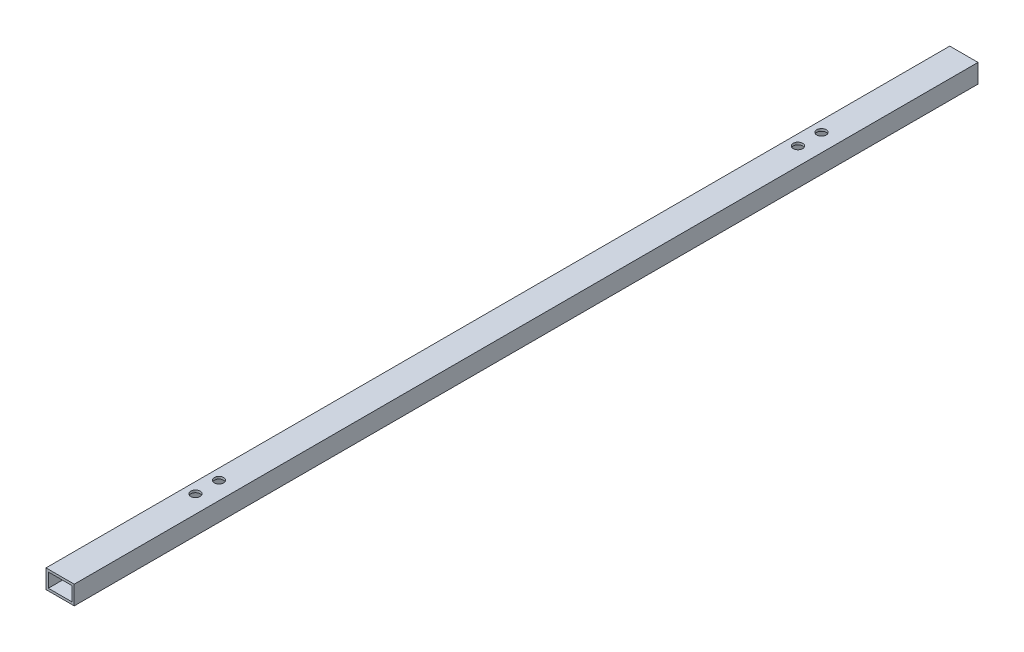
ISO-10303-21;
HEADER;
FILE_DESCRIPTION(('STEP AP214'),'2;1');
FILE_NAME('part.step','',(''),(''),'','','');
FILE_SCHEMA(('AUTOMOTIVE_DESIGN { 1 0 10303 214 1 1 1 1 }'));
ENDSEC;
DATA;
#1=APPLICATION_CONTEXT('core data for automotive mechanical design processes');
#2=APPLICATION_PROTOCOL_DEFINITION('international standard','automotive_design',2000,#1);
#3=PRODUCT_CONTEXT('',#1,'mechanical');
#4=PRODUCT('Part','Part','',(#3));
#5=PRODUCT_RELATED_PRODUCT_CATEGORY('part','',(#4));
#6=PRODUCT_DEFINITION_FORMATION('','',#4);
#7=PRODUCT_DEFINITION_CONTEXT('part definition',#1,'design');
#8=PRODUCT_DEFINITION('design','',#6,#7);
#9=PRODUCT_DEFINITION_SHAPE('','',#8);
#10=(LENGTH_UNIT() NAMED_UNIT(*) SI_UNIT(.MILLI.,.METRE.));
#11=(NAMED_UNIT(*) PLANE_ANGLE_UNIT() SI_UNIT($,.RADIAN.));
#12=(NAMED_UNIT(*) SI_UNIT($,.STERADIAN.) SOLID_ANGLE_UNIT());
#13=UNCERTAINTY_MEASURE_WITH_UNIT(LENGTH_MEASURE(1.E-05),#10,'distance_accuracy_value','');
#14=(GEOMETRIC_REPRESENTATION_CONTEXT(3) GLOBAL_UNCERTAINTY_ASSIGNED_CONTEXT((#13)) GLOBAL_UNIT_ASSIGNED_CONTEXT((#10,
#11,#12)) REPRESENTATION_CONTEXT('',''));
#15=CARTESIAN_POINT('',(0.,0.,0.));
#16=DIRECTION('',(0.,0.,1.));
#17=DIRECTION('',(1.,0.,0.));
#18=AXIS2_PLACEMENT_3D('',#15,#16,#17);
#19=CARTESIAN_POINT('',(19.05,-12.7,609.6));
#20=DIRECTION('',(0.,1.,0.));
#21=DIRECTION('',(0.,0.,1.));
#22=AXIS2_PLACEMENT_3D('',#19,#20,#21);
#23=PLANE('',#22);
#24=CARTESIAN_POINT('',(-4.7625,-12.7,-422.275));
#25=DIRECTION('',(0.,1.,0.));
#26=DIRECTION('',(0.,0.,1.));
#27=AXIS2_PLACEMENT_3D('',#24,#25,#26);
#28=CIRCLE('',#27,6.35);
#29=CARTESIAN_POINT('',(-4.7625,-12.7,-415.925));
#30=VERTEX_POINT('',#29);
#31=EDGE_CURVE('E239',#30,#30,#28,.T.);
#32=ORIENTED_EDGE('',*,*,#31,.T.);
#33=EDGE_LOOP('',(#32));
#34=FACE_BOUND('',#33,.T.);
#35=CARTESIAN_POINT('',(-4.7625,-12.7,390.525));
#36=DIRECTION('',(0.,1.,0.));
#37=DIRECTION('',(0.,0.,1.));
#38=AXIS2_PLACEMENT_3D('',#35,#36,#37);
#39=CIRCLE('',#38,6.34999999999999);
#40=CARTESIAN_POINT('',(-4.7625,-12.7,396.875));
#41=VERTEX_POINT('',#40);
#42=EDGE_CURVE('E205',#41,#41,#39,.T.);
#43=ORIENTED_EDGE('',*,*,#42,.T.);
#44=EDGE_LOOP('',(#43));
#45=FACE_BOUND('',#44,.T.);
#46=DIRECTION('',(0.,0.,-1.));
#47=VECTOR('',#46,1.);
#48=CARTESIAN_POINT('',(-19.05,-12.7,609.6));
#49=LINE('',#48,#47);
#50=CARTESIAN_POINT('',(-19.05,-12.7,609.6));
#51=VERTEX_POINT('',#50);
#52=CARTESIAN_POINT('',(-19.05,-12.7,-609.6));
#53=VERTEX_POINT('',#52);
#54=EDGE_CURVE('E11',#51,#53,#49,.T.);
#55=ORIENTED_EDGE('',*,*,#54,.T.);
#56=DIRECTION('',(1.,0.,0.));
#57=VECTOR('',#56,1.);
#58=CARTESIAN_POINT('',(19.05,-12.7,-609.6));
#59=LINE('',#58,#57);
#60=CARTESIAN_POINT('',(19.05,-12.7,-609.6));
#61=VERTEX_POINT('',#60);
#62=EDGE_CURVE('E152',#53,#61,#59,.T.);
#63=ORIENTED_EDGE('',*,*,#62,.T.);
#64=DIRECTION('',(0.,0.,-1.));
#65=VECTOR('',#64,1.);
#66=CARTESIAN_POINT('',(19.05,-12.7,609.6));
#67=LINE('',#66,#65);
#68=CARTESIAN_POINT('',(19.05,-12.7,609.6));
#69=VERTEX_POINT('',#68);
#70=EDGE_CURVE('E49',#69,#61,#67,.T.);
#71=ORIENTED_EDGE('',*,*,#70,.F.);
#72=DIRECTION('',(1.,0.,0.));
#73=VECTOR('',#72,1.);
#74=CARTESIAN_POINT('',(19.05,-12.7,609.6));
#75=LINE('',#74,#73);
#76=EDGE_CURVE('E184',#51,#69,#75,.T.);
#77=ORIENTED_EDGE('',*,*,#76,.F.);
#78=EDGE_LOOP('',(#55,#63,#71,#77));
#79=FACE_BOUND('',#78,.T.);
#80=CARTESIAN_POINT('',(-4.7625,-12.7,-390.525));
#81=DIRECTION('',(0.,1.,0.));
#82=DIRECTION('',(0.,0.,1.));
#83=AXIS2_PLACEMENT_3D('',#80,#81,#82);
#84=CIRCLE('',#83,6.35);
#85=CARTESIAN_POINT('',(-4.7625,-12.7,-384.175));
#86=VERTEX_POINT('',#85);
#87=EDGE_CURVE('E240',#86,#86,#84,.F.);
#88=ORIENTED_EDGE('',*,*,#87,.F.);
#89=EDGE_LOOP('',(#88));
#90=FACE_BOUND('',#89,.T.);
#91=CARTESIAN_POINT('',(-4.7625,-12.7,422.275));
#92=DIRECTION('',(0.,1.,0.));
#93=DIRECTION('',(0.,0.,1.));
#94=AXIS2_PLACEMENT_3D('',#91,#92,#93);
#95=CIRCLE('',#94,6.34999999999999);
#96=CARTESIAN_POINT('',(-4.7625,-12.7,428.625));
#97=VERTEX_POINT('',#96);
#98=EDGE_CURVE('E231',#97,#97,#95,.F.);
#99=ORIENTED_EDGE('',*,*,#98,.F.);
#100=EDGE_LOOP('',(#99));
#101=FACE_BOUND('',#100,.T.);
#102=ADVANCED_FACE('F39',(#34,#45,#79,#90,#101),#23,.F.);
#103=CARTESIAN_POINT('',(19.05,12.7,609.6));
#104=DIRECTION('',(0.,-1.,0.));
#105=DIRECTION('',(0.,0.,-1.));
#106=AXIS2_PLACEMENT_3D('',#103,#104,#105);
#107=PLANE('',#106);
#108=CARTESIAN_POINT('',(-4.7625,12.7,-422.275));
#109=DIRECTION('',(0.,1.,0.));
#110=DIRECTION('',(0.,0.,1.));
#111=AXIS2_PLACEMENT_3D('',#108,#109,#110);
#112=CIRCLE('',#111,6.35);
#113=CARTESIAN_POINT('',(-4.7625,12.7,-415.925));
#114=VERTEX_POINT('',#113);
#115=EDGE_CURVE('E235',#114,#114,#112,.T.);
#116=ORIENTED_EDGE('',*,*,#115,.F.);
#117=EDGE_LOOP('',(#116));
#118=FACE_BOUND('',#117,.T.);
#119=CARTESIAN_POINT('',(-4.7625,12.7,390.525));
#120=DIRECTION('',(0.,1.,0.));
#121=DIRECTION('',(0.,0.,1.));
#122=AXIS2_PLACEMENT_3D('',#119,#120,#121);
#123=CIRCLE('',#122,6.34999999999999);
#124=CARTESIAN_POINT('',(-4.7625,12.7,396.875));
#125=VERTEX_POINT('',#124);
#126=EDGE_CURVE('E227',#125,#125,#123,.T.);
#127=ORIENTED_EDGE('',*,*,#126,.F.);
#128=EDGE_LOOP('',(#127));
#129=FACE_BOUND('',#128,.T.);
#130=DIRECTION('',(0.,0.,-1.));
#131=VECTOR('',#130,1.);
#132=CARTESIAN_POINT('',(19.05,12.7,609.6));
#133=LINE('',#132,#131);
#134=CARTESIAN_POINT('',(19.05,12.7,609.6));
#135=VERTEX_POINT('',#134);
#136=CARTESIAN_POINT('',(19.05,12.7,-609.6));
#137=VERTEX_POINT('',#136);
#138=EDGE_CURVE('E195',#135,#137,#133,.T.);
#139=ORIENTED_EDGE('',*,*,#138,.T.);
#140=DIRECTION('',(-1.,0.,0.));
#141=VECTOR('',#140,1.);
#142=CARTESIAN_POINT('',(19.05,12.7,-609.6));
#143=LINE('',#142,#141);
#144=CARTESIAN_POINT('',(-19.05,12.7,-609.6));
#145=VERTEX_POINT('',#144);
#146=EDGE_CURVE('E160',#137,#145,#143,.T.);
#147=ORIENTED_EDGE('',*,*,#146,.T.);
#148=DIRECTION('',(0.,0.,-1.));
#149=VECTOR('',#148,1.);
#150=CARTESIAN_POINT('',(-19.05,12.7,609.6));
#151=LINE('',#150,#149);
#152=CARTESIAN_POINT('',(-19.05,12.7,609.6));
#153=VERTEX_POINT('',#152);
#154=EDGE_CURVE('E192',#153,#145,#151,.T.);
#155=ORIENTED_EDGE('',*,*,#154,.F.);
#156=DIRECTION('',(-1.,0.,0.));
#157=VECTOR('',#156,1.);
#158=CARTESIAN_POINT('',(19.05,12.7,609.6));
#159=LINE('',#158,#157);
#160=EDGE_CURVE('E65',#135,#153,#159,.T.);
#161=ORIENTED_EDGE('',*,*,#160,.F.);
#162=EDGE_LOOP('',(#139,#147,#155,#161));
#163=FACE_BOUND('',#162,.T.);
#164=CARTESIAN_POINT('',(-4.7625,12.7,-390.525));
#165=DIRECTION('',(0.,1.,0.));
#166=DIRECTION('',(0.,0.,1.));
#167=AXIS2_PLACEMENT_3D('',#164,#165,#166);
#168=CIRCLE('',#167,6.35);
#169=CARTESIAN_POINT('',(-4.7625,12.7,-384.175));
#170=VERTEX_POINT('',#169);
#171=EDGE_CURVE('E251',#170,#170,#168,.F.);
#172=ORIENTED_EDGE('',*,*,#171,.T.);
#173=EDGE_LOOP('',(#172));
#174=FACE_BOUND('',#173,.T.);
#175=CARTESIAN_POINT('',(-4.7625,12.7,422.275));
#176=DIRECTION('',(0.,1.,0.));
#177=DIRECTION('',(0.,0.,1.));
#178=AXIS2_PLACEMENT_3D('',#175,#176,#177);
#179=CIRCLE('',#178,6.34999999999999);
#180=CARTESIAN_POINT('',(-4.7625,12.7,428.625));
#181=VERTEX_POINT('',#180);
#182=EDGE_CURVE('E244',#181,#181,#179,.F.);
#183=ORIENTED_EDGE('',*,*,#182,.T.);
#184=EDGE_LOOP('',(#183));
#185=FACE_BOUND('',#184,.T.);
#186=ADVANCED_FACE('F263',(#118,#129,#163,#174,#185),#107,.F.);
#187=CARTESIAN_POINT('',(15.875,-9.525,609.6));
#188=DIRECTION('',(0.,1.,0.));
#189=DIRECTION('',(0.,0.,1.));
#190=AXIS2_PLACEMENT_3D('',#187,#188,#189);
#191=PLANE('',#190);
#192=CARTESIAN_POINT('',(-4.7625,-9.525,-390.525));
#193=DIRECTION('',(0.,1.,0.));
#194=DIRECTION('',(0.,0.,1.));
#195=AXIS2_PLACEMENT_3D('',#192,#193,#194);
#196=CIRCLE('',#195,6.35);
#197=CARTESIAN_POINT('',(-4.7625,-9.525,-384.175));
#198=VERTEX_POINT('',#197);
#199=EDGE_CURVE('E209',#198,#198,#196,.F.);
#200=ORIENTED_EDGE('',*,*,#199,.T.);
#201=EDGE_LOOP('',(#200));
#202=FACE_BOUND('',#201,.T.);
#203=CARTESIAN_POINT('',(-4.7625,-9.525,390.525));
#204=DIRECTION('',(0.,1.,0.));
#205=DIRECTION('',(0.,0.,1.));
#206=AXIS2_PLACEMENT_3D('',#203,#204,#205);
#207=CIRCLE('',#206,6.34999999999999);
#208=CARTESIAN_POINT('',(-4.7625,-9.525,396.875));
#209=VERTEX_POINT('',#208);
#210=EDGE_CURVE('E204',#209,#209,#207,.T.);
#211=ORIENTED_EDGE('',*,*,#210,.F.);
#212=EDGE_LOOP('',(#211));
#213=FACE_BOUND('',#212,.T.);
#214=DIRECTION('',(0.,0.,-1.));
#215=VECTOR('',#214,1.);
#216=CARTESIAN_POINT('',(15.875,-9.525,609.6));
#217=LINE('',#216,#215);
#218=CARTESIAN_POINT('',(15.875,-9.525,609.6));
#219=VERTEX_POINT('',#218);
#220=CARTESIAN_POINT('',(15.875,-9.525,-609.6));
#221=VERTEX_POINT('',#220);
#222=EDGE_CURVE('E120',#219,#221,#217,.T.);
#223=ORIENTED_EDGE('',*,*,#222,.T.);
#224=DIRECTION('',(1.,0.,0.));
#225=VECTOR('',#224,1.);
#226=CARTESIAN_POINT('',(15.875,-9.525,-609.6));
#227=LINE('',#226,#225);
#228=CARTESIAN_POINT('',(-15.875,-9.525,-609.6));
#229=VERTEX_POINT('',#228);
#230=EDGE_CURVE('E123',#229,#221,#227,.T.);
#231=ORIENTED_EDGE('',*,*,#230,.F.);
#232=DIRECTION('',(0.,0.,-1.));
#233=VECTOR('',#232,1.);
#234=CARTESIAN_POINT('',(-15.875,-9.525,609.6));
#235=LINE('',#234,#233);
#236=CARTESIAN_POINT('',(-15.875,-9.525,609.6));
#237=VERTEX_POINT('',#236);
#238=EDGE_CURVE('E107',#237,#229,#235,.T.);
#239=ORIENTED_EDGE('',*,*,#238,.F.);
#240=DIRECTION('',(1.,0.,0.));
#241=VECTOR('',#240,1.);
#242=CARTESIAN_POINT('',(15.875,-9.525,609.6));
#243=LINE('',#242,#241);
#244=EDGE_CURVE('E166',#237,#219,#243,.T.);
#245=ORIENTED_EDGE('',*,*,#244,.T.);
#246=EDGE_LOOP('',(#223,#231,#239,#245));
#247=FACE_BOUND('',#246,.T.);
#248=CARTESIAN_POINT('',(-4.7625,-9.525,-422.275));
#249=DIRECTION('',(0.,1.,0.));
#250=DIRECTION('',(0.,0.,1.));
#251=AXIS2_PLACEMENT_3D('',#248,#249,#250);
#252=CIRCLE('',#251,6.35);
#253=CARTESIAN_POINT('',(-4.7625,-9.525,-415.925));
#254=VERTEX_POINT('',#253);
#255=EDGE_CURVE('E213',#254,#254,#252,.T.);
#256=ORIENTED_EDGE('',*,*,#255,.F.);
#257=EDGE_LOOP('',(#256));
#258=FACE_BOUND('',#257,.T.);
#259=CARTESIAN_POINT('',(-4.7625,-9.525,422.275));
#260=DIRECTION('',(0.,1.,0.));
#261=DIRECTION('',(0.,0.,1.));
#262=AXIS2_PLACEMENT_3D('',#259,#260,#261);
#263=CIRCLE('',#262,6.34999999999999);
#264=CARTESIAN_POINT('',(-4.7625,-9.525,428.625));
#265=VERTEX_POINT('',#264);
#266=EDGE_CURVE('E137',#265,#265,#263,.F.);
#267=ORIENTED_EDGE('',*,*,#266,.T.);
#268=EDGE_LOOP('',(#267));
#269=FACE_BOUND('',#268,.T.);
#270=ADVANCED_FACE('F124',(#202,#213,#247,#258,#269),#191,.T.);
#271=CARTESIAN_POINT('',(15.875,9.525,609.6));
#272=DIRECTION('',(0.,-1.,0.));
#273=DIRECTION('',(1.,0.,0.));
#274=AXIS2_PLACEMENT_3D('',#271,#272,#273);
#275=PLANE('',#274);
#276=CARTESIAN_POINT('',(-4.7625,9.525,-390.525));
#277=DIRECTION('',(0.,-1.,0.));
#278=DIRECTION('',(1.,0.,0.));
#279=AXIS2_PLACEMENT_3D('',#276,#277,#278);
#280=CIRCLE('',#279,6.35);
#281=CARTESIAN_POINT('',(1.5875,9.525,-390.525));
#282=VERTEX_POINT('',#281);
#283=EDGE_CURVE('E206',#282,#282,#280,.F.);
#284=ORIENTED_EDGE('',*,*,#283,.T.);
#285=EDGE_LOOP('',(#284));
#286=FACE_BOUND('',#285,.T.);
#287=CARTESIAN_POINT('',(-4.7625,9.525,390.525));
#288=DIRECTION('',(0.,-1.,0.));
#289=DIRECTION('',(1.,0.,0.));
#290=AXIS2_PLACEMENT_3D('',#287,#288,#289);
#291=CIRCLE('',#290,6.34999999999999);
#292=CARTESIAN_POINT('',(1.58749999999999,9.525,390.525));
#293=VERTEX_POINT('',#292);
#294=EDGE_CURVE('E200',#293,#293,#291,.T.);
#295=ORIENTED_EDGE('',*,*,#294,.F.);
#296=EDGE_LOOP('',(#295));
#297=FACE_BOUND('',#296,.T.);
#298=DIRECTION('',(0.,0.,-1.));
#299=VECTOR('',#298,1.);
#300=CARTESIAN_POINT('',(-15.875,9.525,609.6));
#301=LINE('',#300,#299);
#302=CARTESIAN_POINT('',(-15.875,9.525,609.6));
#303=VERTEX_POINT('',#302);
#304=CARTESIAN_POINT('',(-15.875,9.525,-609.6));
#305=VERTEX_POINT('',#304);
#306=EDGE_CURVE('E175',#303,#305,#301,.T.);
#307=ORIENTED_EDGE('',*,*,#306,.T.);
#308=DIRECTION('',(-1.,0.,0.));
#309=VECTOR('',#308,1.);
#310=CARTESIAN_POINT('',(15.875,9.525,-609.6));
#311=LINE('',#310,#309);
#312=CARTESIAN_POINT('',(15.875,9.525,-609.6));
#313=VERTEX_POINT('',#312);
#314=EDGE_CURVE('E135',#313,#305,#311,.T.);
#315=ORIENTED_EDGE('',*,*,#314,.F.);
#316=DIRECTION('',(0.,0.,-1.));
#317=VECTOR('',#316,1.);
#318=CARTESIAN_POINT('',(15.875,9.525,609.6));
#319=LINE('',#318,#317);
#320=CARTESIAN_POINT('',(15.875,9.525,609.6));
#321=VERTEX_POINT('',#320);
#322=EDGE_CURVE('E57',#321,#313,#319,.T.);
#323=ORIENTED_EDGE('',*,*,#322,.F.);
#324=DIRECTION('',(-1.,0.,0.));
#325=VECTOR('',#324,1.);
#326=CARTESIAN_POINT('',(15.875,9.525,609.6));
#327=LINE('',#326,#325);
#328=EDGE_CURVE('E172',#321,#303,#327,.T.);
#329=ORIENTED_EDGE('',*,*,#328,.T.);
#330=EDGE_LOOP('',(#307,#315,#323,#329));
#331=FACE_BOUND('',#330,.T.);
#332=CARTESIAN_POINT('',(-4.7625,9.525,-422.275));
#333=DIRECTION('',(0.,-1.,0.));
#334=DIRECTION('',(1.,0.,0.));
#335=AXIS2_PLACEMENT_3D('',#332,#333,#334);
#336=CIRCLE('',#335,6.35);
#337=CARTESIAN_POINT('',(1.5875,9.525,-422.275));
#338=VERTEX_POINT('',#337);
#339=EDGE_CURVE('E210',#338,#338,#336,.T.);
#340=ORIENTED_EDGE('',*,*,#339,.F.);
#341=EDGE_LOOP('',(#340));
#342=FACE_BOUND('',#341,.T.);
#343=CARTESIAN_POINT('',(-4.7625,9.525,422.275));
#344=DIRECTION('',(0.,-1.,0.));
#345=DIRECTION('',(1.,0.,0.));
#346=AXIS2_PLACEMENT_3D('',#343,#344,#345);
#347=CIRCLE('',#346,6.34999999999999);
#348=CARTESIAN_POINT('',(1.58749999999999,9.525,422.275));
#349=VERTEX_POINT('',#348);
#350=EDGE_CURVE('E43',#349,#349,#347,.F.);
#351=ORIENTED_EDGE('',*,*,#350,.T.);
#352=EDGE_LOOP('',(#351));
#353=FACE_BOUND('',#352,.T.);
#354=ADVANCED_FACE('F303',(#286,#297,#331,#342,#353),#275,.T.);
#355=CARTESIAN_POINT('',(0.,0.,609.6));
#356=DIRECTION('',(0.,0.,1.));
#357=DIRECTION('',(1.,0.,0.));
#358=AXIS2_PLACEMENT_3D('',#355,#356,#357);
#359=PLANE('',#358);
#360=DIRECTION('',(0.,-1.,0.));
#361=VECTOR('',#360,1.);
#362=CARTESIAN_POINT('',(-19.05,-12.7,609.6));
#363=LINE('',#362,#361);
#364=EDGE_CURVE('E119',#153,#51,#363,.T.);
#365=ORIENTED_EDGE('',*,*,#364,.T.);
#366=ORIENTED_EDGE('',*,*,#76,.T.);
#367=DIRECTION('',(0.,1.,0.));
#368=VECTOR('',#367,1.);
#369=CARTESIAN_POINT('',(19.05,-12.7,609.6));
#370=LINE('',#369,#368);
#371=EDGE_CURVE('E187',#69,#135,#370,.T.);
#372=ORIENTED_EDGE('',*,*,#371,.T.);
#373=ORIENTED_EDGE('',*,*,#160,.T.);
#374=EDGE_LOOP('',(#365,#366,#372,#373));
#375=FACE_BOUND('',#374,.T.);
#376=ORIENTED_EDGE('',*,*,#244,.F.);
#377=DIRECTION('',(0.,-1.,0.));
#378=VECTOR('',#377,1.);
#379=CARTESIAN_POINT('',(-15.875,-9.525,609.6));
#380=LINE('',#379,#378);
#381=EDGE_CURVE('E115',#303,#237,#380,.T.);
#382=ORIENTED_EDGE('',*,*,#381,.F.);
#383=ORIENTED_EDGE('',*,*,#328,.F.);
#384=DIRECTION('',(0.,1.,0.));
#385=VECTOR('',#384,1.);
#386=CARTESIAN_POINT('',(15.875,-9.525,609.6));
#387=LINE('',#386,#385);
#388=EDGE_CURVE('E169',#219,#321,#387,.T.);
#389=ORIENTED_EDGE('',*,*,#388,.F.);
#390=EDGE_LOOP('',(#376,#382,#383,#389));
#391=FACE_BOUND('',#390,.T.);
#392=ADVANCED_FACE('F309',(#375,#391),#359,.T.);
#393=CARTESIAN_POINT('',(-19.05,-12.7,609.6));
#394=DIRECTION('',(1.,0.,0.));
#395=DIRECTION('',(0.,0.,-1.));
#396=AXIS2_PLACEMENT_3D('',#393,#394,#395);
#397=PLANE('',#396);
#398=ORIENTED_EDGE('',*,*,#154,.T.);
#399=DIRECTION('',(0.,-1.,0.));
#400=VECTOR('',#399,1.);
#401=CARTESIAN_POINT('',(-19.05,-12.7,-609.6));
#402=LINE('',#401,#400);
#403=EDGE_CURVE('E148',#145,#53,#402,.T.);
#404=ORIENTED_EDGE('',*,*,#403,.T.);
#405=ORIENTED_EDGE('',*,*,#54,.F.);
#406=ORIENTED_EDGE('',*,*,#364,.F.);
#407=EDGE_LOOP('',(#398,#404,#405,#406));
#408=FACE_BOUND('',#407,.T.);
#409=ADVANCED_FACE('F41',(#408),#397,.F.);
#410=CARTESIAN_POINT('',(19.05,-12.7,609.6));
#411=DIRECTION('',(-1.,0.,0.));
#412=DIRECTION('',(0.,-1.,0.));
#413=AXIS2_PLACEMENT_3D('',#410,#411,#412);
#414=PLANE('',#413);
#415=ORIENTED_EDGE('',*,*,#70,.T.);
#416=DIRECTION('',(0.,1.,0.));
#417=VECTOR('',#416,1.);
#418=CARTESIAN_POINT('',(19.05,-12.7,-609.6));
#419=LINE('',#418,#417);
#420=EDGE_CURVE('E156',#61,#137,#419,.T.);
#421=ORIENTED_EDGE('',*,*,#420,.T.);
#422=ORIENTED_EDGE('',*,*,#138,.F.);
#423=ORIENTED_EDGE('',*,*,#371,.F.);
#424=EDGE_LOOP('',(#415,#421,#422,#423));
#425=FACE_BOUND('',#424,.T.);
#426=ADVANCED_FACE('F311',(#425),#414,.F.);
#427=CARTESIAN_POINT('',(-15.875,-9.525,609.6));
#428=DIRECTION('',(1.,0.,0.));
#429=DIRECTION('',(0.,0.,-1.));
#430=AXIS2_PLACEMENT_3D('',#427,#428,#429);
#431=PLANE('',#430);
#432=ORIENTED_EDGE('',*,*,#238,.T.);
#433=DIRECTION('',(0.,-1.,0.));
#434=VECTOR('',#433,1.);
#435=CARTESIAN_POINT('',(-15.875,-9.525,-609.6));
#436=LINE('',#435,#434);
#437=EDGE_CURVE('E112',#305,#229,#436,.T.);
#438=ORIENTED_EDGE('',*,*,#437,.F.);
#439=ORIENTED_EDGE('',*,*,#306,.F.);
#440=ORIENTED_EDGE('',*,*,#381,.T.);
#441=EDGE_LOOP('',(#432,#438,#439,#440));
#442=FACE_BOUND('',#441,.T.);
#443=ADVANCED_FACE('F109',(#442),#431,.T.);
#444=CARTESIAN_POINT('',(15.875,-9.525,609.6));
#445=DIRECTION('',(-1.,0.,0.));
#446=DIRECTION('',(0.,0.,1.));
#447=AXIS2_PLACEMENT_3D('',#444,#445,#446);
#448=PLANE('',#447);
#449=ORIENTED_EDGE('',*,*,#322,.T.);
#450=DIRECTION('',(0.,1.,0.));
#451=VECTOR('',#450,1.);
#452=CARTESIAN_POINT('',(15.875,-9.525,-609.6));
#453=LINE('',#452,#451);
#454=EDGE_CURVE('E131',#221,#313,#453,.T.);
#455=ORIENTED_EDGE('',*,*,#454,.F.);
#456=ORIENTED_EDGE('',*,*,#222,.F.);
#457=ORIENTED_EDGE('',*,*,#388,.T.);
#458=EDGE_LOOP('',(#449,#455,#456,#457));
#459=FACE_BOUND('',#458,.T.);
#460=ADVANCED_FACE('F318',(#459),#448,.T.);
#461=CARTESIAN_POINT('',(0.,0.,-609.6));
#462=DIRECTION('',(0.,0.,1.));
#463=DIRECTION('',(1.,0.,0.));
#464=AXIS2_PLACEMENT_3D('',#461,#462,#463);
#465=PLANE('',#464);
#466=ORIENTED_EDGE('',*,*,#314,.T.);
#467=ORIENTED_EDGE('',*,*,#437,.T.);
#468=ORIENTED_EDGE('',*,*,#230,.T.);
#469=ORIENTED_EDGE('',*,*,#454,.T.);
#470=EDGE_LOOP('',(#466,#467,#468,#469));
#471=FACE_BOUND('',#470,.T.);
#472=ORIENTED_EDGE('',*,*,#403,.F.);
#473=ORIENTED_EDGE('',*,*,#146,.F.);
#474=ORIENTED_EDGE('',*,*,#420,.F.);
#475=ORIENTED_EDGE('',*,*,#62,.F.);
#476=EDGE_LOOP('',(#472,#473,#474,#475));
#477=FACE_BOUND('',#476,.T.);
#478=ADVANCED_FACE('F133',(#471,#477),#465,.F.);
#479=CARTESIAN_POINT('',(-4.7625,-12.7,390.525));
#480=DIRECTION('',(0.,1.,0.));
#481=DIRECTION('',(0.,0.,1.));
#482=AXIS2_PLACEMENT_3D('',#479,#480,#481);
#483=CYLINDRICAL_SURFACE('',#482,6.34999999999999);
#484=ORIENTED_EDGE('',*,*,#294,.T.);
#485=EDGE_LOOP('',(#484));
#486=FACE_BOUND('',#485,.T.);
#487=ORIENTED_EDGE('',*,*,#126,.T.);
#488=EDGE_LOOP('',(#487));
#489=FACE_BOUND('',#488,.T.);
#490=ADVANCED_FACE('F290',(#486,#489),#483,.F.);
#491=CARTESIAN_POINT('',(-4.7625,-12.7,-390.525));
#492=DIRECTION('',(0.,1.,0.));
#493=DIRECTION('',(0.,0.,1.));
#494=AXIS2_PLACEMENT_3D('',#491,#492,#493);
#495=CYLINDRICAL_SURFACE('',#494,6.35);
#496=ORIENTED_EDGE('',*,*,#283,.F.);
#497=EDGE_LOOP('',(#496));
#498=FACE_BOUND('',#497,.T.);
#499=ORIENTED_EDGE('',*,*,#171,.F.);
#500=EDGE_LOOP('',(#499));
#501=FACE_BOUND('',#500,.T.);
#502=ADVANCED_FACE('F291',(#498,#501),#495,.F.);
#503=CARTESIAN_POINT('',(-4.7625,-12.7,-422.275));
#504=DIRECTION('',(0.,1.,0.));
#505=DIRECTION('',(0.,0.,1.));
#506=AXIS2_PLACEMENT_3D('',#503,#504,#505);
#507=CYLINDRICAL_SURFACE('',#506,6.35);
#508=ORIENTED_EDGE('',*,*,#339,.T.);
#509=EDGE_LOOP('',(#508));
#510=FACE_BOUND('',#509,.T.);
#511=ORIENTED_EDGE('',*,*,#115,.T.);
#512=EDGE_LOOP('',(#511));
#513=FACE_BOUND('',#512,.T.);
#514=ADVANCED_FACE('F278',(#510,#513),#507,.F.);
#515=CARTESIAN_POINT('',(-4.7625,-12.7,422.275));
#516=DIRECTION('',(0.,1.,0.));
#517=DIRECTION('',(0.,0.,1.));
#518=AXIS2_PLACEMENT_3D('',#515,#516,#517);
#519=CYLINDRICAL_SURFACE('',#518,6.34999999999999);
#520=ORIENTED_EDGE('',*,*,#350,.F.);
#521=EDGE_LOOP('',(#520));
#522=FACE_BOUND('',#521,.T.);
#523=ORIENTED_EDGE('',*,*,#182,.F.);
#524=EDGE_LOOP('',(#523));
#525=FACE_BOUND('',#524,.T.);
#526=ADVANCED_FACE('F272',(#522,#525),#519,.F.);
#527=ORIENTED_EDGE('',*,*,#210,.T.);
#528=EDGE_LOOP('',(#527));
#529=FACE_BOUND('',#528,.T.);
#530=ORIENTED_EDGE('',*,*,#42,.F.);
#531=EDGE_LOOP('',(#530));
#532=FACE_BOUND('',#531,.T.);
#533=ADVANCED_FACE('F282',(#529,#532),#483,.F.);
#534=ORIENTED_EDGE('',*,*,#199,.F.);
#535=EDGE_LOOP('',(#534));
#536=FACE_BOUND('',#535,.T.);
#537=ORIENTED_EDGE('',*,*,#87,.T.);
#538=EDGE_LOOP('',(#537));
#539=FACE_BOUND('',#538,.T.);
#540=ADVANCED_FACE('F259',(#536,#539),#495,.F.);
#541=ORIENTED_EDGE('',*,*,#255,.T.);
#542=EDGE_LOOP('',(#541));
#543=FACE_BOUND('',#542,.T.);
#544=ORIENTED_EDGE('',*,*,#31,.F.);
#545=EDGE_LOOP('',(#544));
#546=FACE_BOUND('',#545,.T.);
#547=ADVANCED_FACE('F269',(#543,#546),#507,.F.);
#548=ORIENTED_EDGE('',*,*,#266,.F.);
#549=EDGE_LOOP('',(#548));
#550=FACE_BOUND('',#549,.T.);
#551=ORIENTED_EDGE('',*,*,#98,.T.);
#552=EDGE_LOOP('',(#551));
#553=FACE_BOUND('',#552,.T.);
#554=ADVANCED_FACE('F267',(#550,#553),#519,.F.);
#555=CLOSED_SHELL('',(#102,#186,#270,#354,#392,#409,#426,#443,#460,#478,#490,#502,#514,#526,
#533,#540,#547,#554));
#556=MANIFOLD_SOLID_BREP('B2',#555);
#557=ADVANCED_BREP_SHAPE_REPRESENTATION('',(#18,#556),#14);
#558=SHAPE_DEFINITION_REPRESENTATION(#9,#557);
ENDSEC;
END-ISO-10303-21;
